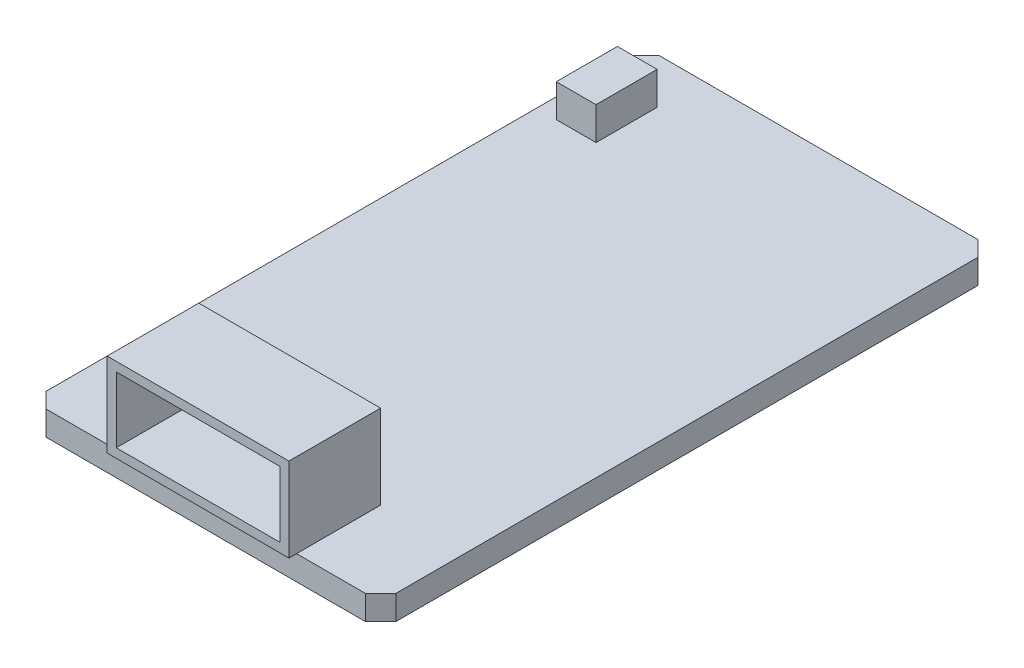
ISO-10303-21;
HEADER;
FILE_DESCRIPTION(('STEP AP214'),'2;1');
FILE_NAME('part.step','',(''),(''),'','','');
FILE_SCHEMA(('AUTOMOTIVE_DESIGN { 1 0 10303 214 1 1 1 1 }'));
ENDSEC;
DATA;
#1=APPLICATION_CONTEXT('core data for automotive mechanical design processes');
#2=APPLICATION_PROTOCOL_DEFINITION('international standard','automotive_design',2000,#1);
#3=PRODUCT_CONTEXT('',#1,'mechanical');
#4=PRODUCT('Part','Part','',(#3));
#5=PRODUCT_RELATED_PRODUCT_CATEGORY('part','',(#4));
#6=PRODUCT_DEFINITION_FORMATION('','',#4);
#7=PRODUCT_DEFINITION_CONTEXT('part definition',#1,'design');
#8=PRODUCT_DEFINITION('design','',#6,#7);
#9=PRODUCT_DEFINITION_SHAPE('','',#8);
#10=(LENGTH_UNIT() NAMED_UNIT(*) SI_UNIT(.MILLI.,.METRE.));
#11=(NAMED_UNIT(*) PLANE_ANGLE_UNIT() SI_UNIT($,.RADIAN.));
#12=(NAMED_UNIT(*) SI_UNIT($,.STERADIAN.) SOLID_ANGLE_UNIT());
#13=UNCERTAINTY_MEASURE_WITH_UNIT(LENGTH_MEASURE(1.E-05),#10,'distance_accuracy_value','');
#14=(GEOMETRIC_REPRESENTATION_CONTEXT(3) GLOBAL_UNCERTAINTY_ASSIGNED_CONTEXT((#13)) GLOBAL_UNIT_ASSIGNED_CONTEXT((#10,
#11,#12)) REPRESENTATION_CONTEXT('',''));
#15=CARTESIAN_POINT('',(0.,0.,0.));
#16=DIRECTION('',(0.,0.,1.));
#17=DIRECTION('',(1.,0.,0.));
#18=AXIS2_PLACEMENT_3D('',#15,#16,#17);
#19=CARTESIAN_POINT('',(0.,0.,20.55));
#20=DIRECTION('',(0.,0.,-1.));
#21=DIRECTION('',(-1.,0.,0.));
#22=AXIS2_PLACEMENT_3D('',#19,#20,#21);
#23=PLANE('',#22);
#24=DIRECTION('',(0.,-1.,0.));
#25=VECTOR('',#24,1.);
#26=CARTESIAN_POINT('',(-5.95,1.6,20.55));
#27=LINE('',#26,#25);
#28=CARTESIAN_POINT('',(-5.95,7.1,20.55));
#29=VERTEX_POINT('',#28);
#30=CARTESIAN_POINT('',(-5.95,1.6,20.55));
#31=VERTEX_POINT('',#30);
#32=EDGE_CURVE('E171',#29,#31,#27,.T.);
#33=ORIENTED_EDGE('',*,*,#32,.T.);
#34=DIRECTION('',(1.,0.,0.));
#35=VECTOR('',#34,1.);
#36=CARTESIAN_POINT('',(-5.95,1.6,20.55));
#37=LINE('',#36,#35);
#38=CARTESIAN_POINT('',(5.95,1.6,20.55));
#39=VERTEX_POINT('',#38);
#40=EDGE_CURVE('E174',#31,#39,#37,.T.);
#41=ORIENTED_EDGE('',*,*,#40,.T.);
#42=DIRECTION('',(0.,1.,0.));
#43=VECTOR('',#42,1.);
#44=CARTESIAN_POINT('',(5.95,1.6,20.55));
#45=LINE('',#44,#43);
#46=CARTESIAN_POINT('',(5.95,7.1,20.55));
#47=VERTEX_POINT('',#46);
#48=EDGE_CURVE('E177',#39,#47,#45,.T.);
#49=ORIENTED_EDGE('',*,*,#48,.T.);
#50=DIRECTION('',(-1.,0.,0.));
#51=VECTOR('',#50,1.);
#52=CARTESIAN_POINT('',(-5.95,7.1,20.55));
#53=LINE('',#52,#51);
#54=EDGE_CURVE('E180',#47,#29,#53,.T.);
#55=ORIENTED_EDGE('',*,*,#54,.T.);
#56=EDGE_LOOP('',(#33,#41,#49,#55));
#57=FACE_BOUND('',#56,.T.);
#58=DIRECTION('',(0.,-1.,0.));
#59=VECTOR('',#58,1.);
#60=CARTESIAN_POINT('',(-5.35,1.6,20.55));
#61=LINE('',#60,#59);
#62=CARTESIAN_POINT('',(-5.35,6.5,20.55));
#63=VERTEX_POINT('',#62);
#64=CARTESIAN_POINT('',(-5.35,2.2,20.55));
#65=VERTEX_POINT('',#64);
#66=EDGE_CURVE('E138',#63,#65,#61,.T.);
#67=ORIENTED_EDGE('',*,*,#66,.F.);
#68=DIRECTION('',(-1.,0.,0.));
#69=VECTOR('',#68,1.);
#70=CARTESIAN_POINT('',(-5.95,6.5,20.55));
#71=LINE('',#70,#69);
#72=CARTESIAN_POINT('',(5.35,6.5,20.55));
#73=VERTEX_POINT('',#72);
#74=EDGE_CURVE('E155',#73,#63,#71,.T.);
#75=ORIENTED_EDGE('',*,*,#74,.F.);
#76=DIRECTION('',(0.,1.,0.));
#77=VECTOR('',#76,1.);
#78=CARTESIAN_POINT('',(5.35,1.6,20.55));
#79=LINE('',#78,#77);
#80=CARTESIAN_POINT('',(5.35,2.2,20.55));
#81=VERTEX_POINT('',#80);
#82=EDGE_CURVE('E82',#81,#73,#79,.T.);
#83=ORIENTED_EDGE('',*,*,#82,.F.);
#84=DIRECTION('',(1.,0.,0.));
#85=VECTOR('',#84,1.);
#86=CARTESIAN_POINT('',(-5.95,2.2,20.55));
#87=LINE('',#86,#85);
#88=EDGE_CURVE('E168',#65,#81,#87,.T.);
#89=ORIENTED_EDGE('',*,*,#88,.F.);
#90=EDGE_LOOP('',(#67,#75,#83,#89));
#91=FACE_BOUND('',#90,.T.);
#92=ADVANCED_FACE('F65',(#57,#91),#23,.F.);
#93=CARTESIAN_POINT('',(-5.95,1.6,14.55));
#94=DIRECTION('',(-1.,0.,0.));
#95=DIRECTION('',(0.,0.,1.));
#96=AXIS2_PLACEMENT_3D('',#93,#94,#95);
#97=PLANE('',#96);
#98=DIRECTION('',(0.,0.,1.));
#99=VECTOR('',#98,1.);
#100=CARTESIAN_POINT('',(-5.95,1.6,14.55));
#101=LINE('',#100,#99);
#102=CARTESIAN_POINT('',(-5.95,1.6,14.55));
#103=VERTEX_POINT('',#102);
#104=EDGE_CURVE('E69',#103,#31,#101,.T.);
#105=ORIENTED_EDGE('',*,*,#104,.T.);
#106=ORIENTED_EDGE('',*,*,#32,.F.);
#107=DIRECTION('',(0.,0.,1.));
#108=VECTOR('',#107,1.);
#109=CARTESIAN_POINT('',(-5.95,7.1,14.55));
#110=LINE('',#109,#108);
#111=CARTESIAN_POINT('',(-5.95,7.1,14.55));
#112=VERTEX_POINT('',#111);
#113=EDGE_CURVE('E12',#112,#29,#110,.T.);
#114=ORIENTED_EDGE('',*,*,#113,.F.);
#115=DIRECTION('',(0.,-1.,0.));
#116=VECTOR('',#115,1.);
#117=CARTESIAN_POINT('',(-5.95,1.6,14.55));
#118=LINE('',#117,#116);
#119=EDGE_CURVE('E183',#112,#103,#118,.T.);
#120=ORIENTED_EDGE('',*,*,#119,.T.);
#121=EDGE_LOOP('',(#105,#106,#114,#120));
#122=FACE_BOUND('',#121,.T.);
#123=ADVANCED_FACE('F67',(#122),#97,.T.);
#124=CARTESIAN_POINT('',(-5.95,7.1,14.55));
#125=DIRECTION('',(0.,1.,0.));
#126=DIRECTION('',(0.,0.,1.));
#127=AXIS2_PLACEMENT_3D('',#124,#125,#126);
#128=PLANE('',#127);
#129=ORIENTED_EDGE('',*,*,#113,.T.);
#130=ORIENTED_EDGE('',*,*,#54,.F.);
#131=DIRECTION('',(0.,0.,1.));
#132=VECTOR('',#131,1.);
#133=CARTESIAN_POINT('',(5.95,7.1,14.55));
#134=LINE('',#133,#132);
#135=CARTESIAN_POINT('',(5.95,7.1,14.55));
#136=VERTEX_POINT('',#135);
#137=EDGE_CURVE('E74',#136,#47,#134,.T.);
#138=ORIENTED_EDGE('',*,*,#137,.F.);
#139=DIRECTION('',(-1.,0.,0.));
#140=VECTOR('',#139,1.);
#141=CARTESIAN_POINT('',(-5.95,7.1,14.55));
#142=LINE('',#141,#140);
#143=EDGE_CURVE('E191',#136,#112,#142,.T.);
#144=ORIENTED_EDGE('',*,*,#143,.T.);
#145=EDGE_LOOP('',(#129,#130,#138,#144));
#146=FACE_BOUND('',#145,.T.);
#147=ADVANCED_FACE('F204',(#146),#128,.T.);
#148=CARTESIAN_POINT('',(5.95,1.6,14.55));
#149=DIRECTION('',(1.,0.,0.));
#150=DIRECTION('',(0.,0.,-1.));
#151=AXIS2_PLACEMENT_3D('',#148,#149,#150);
#152=PLANE('',#151);
#153=ORIENTED_EDGE('',*,*,#137,.T.);
#154=ORIENTED_EDGE('',*,*,#48,.F.);
#155=DIRECTION('',(0.,0.,1.));
#156=VECTOR('',#155,1.);
#157=CARTESIAN_POINT('',(5.95,1.6,14.55));
#158=LINE('',#157,#156);
#159=CARTESIAN_POINT('',(5.95,1.6,14.55));
#160=VERTEX_POINT('',#159);
#161=EDGE_CURVE('E194',#160,#39,#158,.T.);
#162=ORIENTED_EDGE('',*,*,#161,.F.);
#163=DIRECTION('',(0.,1.,0.));
#164=VECTOR('',#163,1.);
#165=CARTESIAN_POINT('',(5.95,1.6,14.55));
#166=LINE('',#165,#164);
#167=EDGE_CURVE('E188',#160,#136,#166,.T.);
#168=ORIENTED_EDGE('',*,*,#167,.T.);
#169=EDGE_LOOP('',(#153,#154,#162,#168));
#170=FACE_BOUND('',#169,.T.);
#171=ADVANCED_FACE('F210',(#170),#152,.T.);
#172=CARTESIAN_POINT('',(-5.95,1.6,14.55));
#173=DIRECTION('',(0.,-1.,0.));
#174=DIRECTION('',(0.,0.,-1.));
#175=AXIS2_PLACEMENT_3D('',#172,#173,#174);
#176=PLANE('',#175);
#177=ORIENTED_EDGE('',*,*,#161,.T.);
#178=ORIENTED_EDGE('',*,*,#40,.F.);
#179=ORIENTED_EDGE('',*,*,#104,.F.);
#180=DIRECTION('',(1.,0.,0.));
#181=VECTOR('',#180,1.);
#182=CARTESIAN_POINT('',(-5.95,1.6,14.55));
#183=LINE('',#182,#181);
#184=EDGE_CURVE('E185',#103,#160,#183,.T.);
#185=ORIENTED_EDGE('',*,*,#184,.T.);
#186=EDGE_LOOP('',(#177,#178,#179,#185));
#187=FACE_BOUND('',#186,.T.);
#188=ADVANCED_FACE('F198',(#187),#176,.T.);
#189=CARTESIAN_POINT('',(0.,0.,14.55));
#190=DIRECTION('',(0.,0.,-1.));
#191=DIRECTION('',(-1.,0.,0.));
#192=AXIS2_PLACEMENT_3D('',#189,#190,#191);
#193=PLANE('',#192);
#194=ORIENTED_EDGE('',*,*,#119,.F.);
#195=ORIENTED_EDGE('',*,*,#143,.F.);
#196=ORIENTED_EDGE('',*,*,#167,.F.);
#197=ORIENTED_EDGE('',*,*,#184,.F.);
#198=EDGE_LOOP('',(#194,#195,#196,#197));
#199=FACE_BOUND('',#198,.T.);
#200=ADVANCED_FACE('F208',(#199),#193,.T.);
#201=CARTESIAN_POINT('',(-5.35,1.6,14.55));
#202=DIRECTION('',(-1.,0.,0.));
#203=DIRECTION('',(0.,0.,1.));
#204=AXIS2_PLACEMENT_3D('',#201,#202,#203);
#205=PLANE('',#204);
#206=DIRECTION('',(0.,0.,1.));
#207=VECTOR('',#206,1.);
#208=CARTESIAN_POINT('',(-5.35,2.2,14.55));
#209=LINE('',#208,#207);
#210=CARTESIAN_POINT('',(-5.35,2.2,15.15));
#211=VERTEX_POINT('',#210);
#212=EDGE_CURVE('E131',#211,#65,#209,.T.);
#213=ORIENTED_EDGE('',*,*,#212,.F.);
#214=DIRECTION('',(0.,-1.,0.));
#215=VECTOR('',#214,1.);
#216=CARTESIAN_POINT('',(-5.35,1.6,15.15));
#217=LINE('',#216,#215);
#218=CARTESIAN_POINT('',(-5.35,6.5,15.15));
#219=VERTEX_POINT('',#218);
#220=EDGE_CURVE('E135',#219,#211,#217,.T.);
#221=ORIENTED_EDGE('',*,*,#220,.F.);
#222=DIRECTION('',(0.,0.,1.));
#223=VECTOR('',#222,1.);
#224=CARTESIAN_POINT('',(-5.35,6.5,14.55));
#225=LINE('',#224,#223);
#226=EDGE_CURVE('E161',#219,#63,#225,.T.);
#227=ORIENTED_EDGE('',*,*,#226,.T.);
#228=ORIENTED_EDGE('',*,*,#66,.T.);
#229=EDGE_LOOP('',(#213,#221,#227,#228));
#230=FACE_BOUND('',#229,.T.);
#231=ADVANCED_FACE('F133',(#230),#205,.F.);
#232=CARTESIAN_POINT('',(-5.95,6.5,14.55));
#233=DIRECTION('',(0.,1.,0.));
#234=DIRECTION('',(0.,0.,1.));
#235=AXIS2_PLACEMENT_3D('',#232,#233,#234);
#236=PLANE('',#235);
#237=ORIENTED_EDGE('',*,*,#226,.F.);
#238=DIRECTION('',(-1.,0.,0.));
#239=VECTOR('',#238,1.);
#240=CARTESIAN_POINT('',(-5.95,6.5,15.15));
#241=LINE('',#240,#239);
#242=CARTESIAN_POINT('',(5.35,6.5,15.15));
#243=VERTEX_POINT('',#242);
#244=EDGE_CURVE('E143',#243,#219,#241,.T.);
#245=ORIENTED_EDGE('',*,*,#244,.F.);
#246=DIRECTION('',(0.,0.,1.));
#247=VECTOR('',#246,1.);
#248=CARTESIAN_POINT('',(5.35,6.5,14.55));
#249=LINE('',#248,#247);
#250=EDGE_CURVE('E162',#243,#73,#249,.T.);
#251=ORIENTED_EDGE('',*,*,#250,.T.);
#252=ORIENTED_EDGE('',*,*,#74,.T.);
#253=EDGE_LOOP('',(#237,#245,#251,#252));
#254=FACE_BOUND('',#253,.T.);
#255=ADVANCED_FACE('F230',(#254),#236,.F.);
#256=CARTESIAN_POINT('',(5.35,1.6,14.55));
#257=DIRECTION('',(1.,0.,0.));
#258=DIRECTION('',(0.,0.,-1.));
#259=AXIS2_PLACEMENT_3D('',#256,#257,#258);
#260=PLANE('',#259);
#261=ORIENTED_EDGE('',*,*,#250,.F.);
#262=DIRECTION('',(0.,1.,0.));
#263=VECTOR('',#262,1.);
#264=CARTESIAN_POINT('',(5.35,1.6,15.15));
#265=LINE('',#264,#263);
#266=CARTESIAN_POINT('',(5.35,2.2,15.15));
#267=VERTEX_POINT('',#266);
#268=EDGE_CURVE('E151',#267,#243,#265,.T.);
#269=ORIENTED_EDGE('',*,*,#268,.F.);
#270=DIRECTION('',(0.,0.,1.));
#271=VECTOR('',#270,1.);
#272=CARTESIAN_POINT('',(5.35,2.2,14.55));
#273=LINE('',#272,#271);
#274=EDGE_CURVE('E142',#267,#81,#273,.T.);
#275=ORIENTED_EDGE('',*,*,#274,.T.);
#276=ORIENTED_EDGE('',*,*,#82,.T.);
#277=EDGE_LOOP('',(#261,#269,#275,#276));
#278=FACE_BOUND('',#277,.T.);
#279=ADVANCED_FACE('F235',(#278),#260,.F.);
#280=CARTESIAN_POINT('',(-5.95,2.2,14.55));
#281=DIRECTION('',(0.,-1.,0.));
#282=DIRECTION('',(0.,0.,-1.));
#283=AXIS2_PLACEMENT_3D('',#280,#281,#282);
#284=PLANE('',#283);
#285=ORIENTED_EDGE('',*,*,#274,.F.);
#286=DIRECTION('',(1.,0.,0.));
#287=VECTOR('',#286,1.);
#288=CARTESIAN_POINT('',(-5.95,2.2,15.15));
#289=LINE('',#288,#287);
#290=EDGE_CURVE('E146',#211,#267,#289,.T.);
#291=ORIENTED_EDGE('',*,*,#290,.F.);
#292=ORIENTED_EDGE('',*,*,#212,.T.);
#293=ORIENTED_EDGE('',*,*,#88,.T.);
#294=EDGE_LOOP('',(#285,#291,#292,#293));
#295=FACE_BOUND('',#294,.T.);
#296=ADVANCED_FACE('F147',(#295),#284,.F.);
#297=CARTESIAN_POINT('',(0.,0.,15.15));
#298=DIRECTION('',(0.,0.,-1.));
#299=DIRECTION('',(-1.,0.,0.));
#300=AXIS2_PLACEMENT_3D('',#297,#298,#299);
#301=PLANE('',#300);
#302=ORIENTED_EDGE('',*,*,#220,.T.);
#303=ORIENTED_EDGE('',*,*,#290,.T.);
#304=ORIENTED_EDGE('',*,*,#268,.T.);
#305=ORIENTED_EDGE('',*,*,#244,.T.);
#306=EDGE_LOOP('',(#302,#303,#304,#305));
#307=FACE_BOUND('',#306,.T.);
#308=ADVANCED_FACE('F153',(#307),#301,.F.);
#309=CLOSED_SHELL('',(#92,#123,#147,#171,#188,#200,#231,#255,#279,#296,#308));
#310=MANIFOLD_SOLID_BREP('B2',#309);
#311=CARTESIAN_POINT('',(0.,1.6,0.));
#312=DIRECTION('',(0.,1.,0.));
#313=DIRECTION('',(0.,0.,1.));
#314=AXIS2_PLACEMENT_3D('',#311,#312,#313);
#315=PLANE('',#314);
#316=DIRECTION('',(0.,0.,-1.));
#317=VECTOR('',#316,1.);
#318=CARTESIAN_POINT('',(11.45,1.6,20.05));
#319=LINE('',#318,#317);
#320=CARTESIAN_POINT('',(11.45,1.6,19.05));
#321=VERTEX_POINT('',#320);
#322=CARTESIAN_POINT('',(11.45,1.6,-19.05));
#323=VERTEX_POINT('',#322);
#324=EDGE_CURVE('E477',#321,#323,#319,.T.);
#325=ORIENTED_EDGE('',*,*,#324,.T.);
#326=DIRECTION('',(0.707106781186548,0.,0.707106781186548));
#327=VECTOR('',#326,1.);
#328=CARTESIAN_POINT('',(15.25,1.6,-15.25));
#329=LINE('',#328,#327);
#330=CARTESIAN_POINT('',(10.45,1.6,-20.05));
#331=VERTEX_POINT('',#330);
#332=EDGE_CURVE('E513',#323,#331,#329,.F.);
#333=ORIENTED_EDGE('',*,*,#332,.T.);
#334=DIRECTION('',(-1.,0.,0.));
#335=VECTOR('',#334,1.);
#336=CARTESIAN_POINT('',(11.45,1.6,-20.05));
#337=LINE('',#336,#335);
#338=CARTESIAN_POINT('',(-10.45,1.6,-20.05));
#339=VERTEX_POINT('',#338);
#340=EDGE_CURVE('E480',#331,#339,#337,.T.);
#341=ORIENTED_EDGE('',*,*,#340,.T.);
#342=DIRECTION('',(0.707106781186548,0.,-0.707106781186548));
#343=VECTOR('',#342,1.);
#344=CARTESIAN_POINT('',(-15.25,1.6,-15.25));
#345=LINE('',#344,#343);
#346=CARTESIAN_POINT('',(-11.45,1.6,-19.05));
#347=VERTEX_POINT('',#346);
#348=EDGE_CURVE('E511',#339,#347,#345,.F.);
#349=ORIENTED_EDGE('',*,*,#348,.T.);
#350=DIRECTION('',(0.,0.,1.));
#351=VECTOR('',#350,1.);
#352=CARTESIAN_POINT('',(-11.45,1.6,20.05));
#353=LINE('',#352,#351);
#354=CARTESIAN_POINT('',(-11.45,1.6,19.05));
#355=VERTEX_POINT('',#354);
#356=EDGE_CURVE('E471',#347,#355,#353,.T.);
#357=ORIENTED_EDGE('',*,*,#356,.T.);
#358=DIRECTION('',(-0.707106781186548,0.,-0.707106781186548));
#359=VECTOR('',#358,1.);
#360=CARTESIAN_POINT('',(-15.25,1.6,15.25));
#361=LINE('',#360,#359);
#362=CARTESIAN_POINT('',(-10.45,1.6,20.05));
#363=VERTEX_POINT('',#362);
#364=EDGE_CURVE('E507',#355,#363,#361,.F.);
#365=ORIENTED_EDGE('',*,*,#364,.T.);
#366=DIRECTION('',(1.,0.,0.));
#367=VECTOR('',#366,1.);
#368=CARTESIAN_POINT('',(11.45,1.6,20.05));
#369=LINE('',#368,#367);
#370=CARTESIAN_POINT('',(10.45,1.6,20.05));
#371=VERTEX_POINT('',#370);
#372=EDGE_CURVE('E474',#363,#371,#369,.T.);
#373=ORIENTED_EDGE('',*,*,#372,.T.);
#374=DIRECTION('',(-0.707106781186548,0.,0.707106781186548));
#375=VECTOR('',#374,1.);
#376=CARTESIAN_POINT('',(15.25,1.6,15.25));
#377=LINE('',#376,#375);
#378=EDGE_CURVE('E509',#371,#321,#377,.F.);
#379=ORIENTED_EDGE('',*,*,#378,.T.);
#380=EDGE_LOOP('',(#325,#333,#341,#349,#357,#365,#373,#379));
#381=FACE_BOUND('',#380,.T.);
#382=DIRECTION('',(1.,0.,0.));
#383=VECTOR('',#382,1.);
#384=CARTESIAN_POINT('',(-10.15,1.6,-13.05));
#385=LINE('',#384,#383);
#386=CARTESIAN_POINT('',(-10.15,1.6,-13.05));
#387=VERTEX_POINT('',#386);
#388=CARTESIAN_POINT('',(-7.55,1.6,-13.05));
#389=VERTEX_POINT('',#388);
#390=EDGE_CURVE('E662',#387,#389,#385,.T.);
#391=ORIENTED_EDGE('',*,*,#390,.F.);
#392=DIRECTION('',(0.,0.,1.));
#393=VECTOR('',#392,1.);
#394=CARTESIAN_POINT('',(-10.15,1.6,-17.05));
#395=LINE('',#394,#393);
#396=CARTESIAN_POINT('',(-10.15,1.6,-17.05));
#397=VERTEX_POINT('',#396);
#398=EDGE_CURVE('E461',#397,#387,#395,.T.);
#399=ORIENTED_EDGE('',*,*,#398,.F.);
#400=DIRECTION('',(-1.,0.,0.));
#401=VECTOR('',#400,1.);
#402=CARTESIAN_POINT('',(-10.15,1.6,-17.05));
#403=LINE('',#402,#401);
#404=CARTESIAN_POINT('',(-7.55,1.6,-17.05));
#405=VERTEX_POINT('',#404);
#406=EDGE_CURVE('E457',#405,#397,#403,.T.);
#407=ORIENTED_EDGE('',*,*,#406,.F.);
#408=DIRECTION('',(0.,0.,-1.));
#409=VECTOR('',#408,1.);
#410=CARTESIAN_POINT('',(-7.55,1.6,-17.05));
#411=LINE('',#410,#409);
#412=EDGE_CURVE('E659',#389,#405,#411,.T.);
#413=ORIENTED_EDGE('',*,*,#412,.F.);
#414=EDGE_LOOP('',(#391,#399,#407,#413));
#415=FACE_BOUND('',#414,.T.);
#416=ADVANCED_FACE('F348',(#381,#415),#315,.T.);
#417=CARTESIAN_POINT('',(-11.45,1.6,20.05));
#418=DIRECTION('',(1.,0.,0.));
#419=DIRECTION('',(0.,0.,-1.));
#420=AXIS2_PLACEMENT_3D('',#417,#418,#419);
#421=PLANE('',#420);
#422=ORIENTED_EDGE('',*,*,#356,.F.);
#423=DIRECTION('',(0.,-1.,0.));
#424=VECTOR('',#423,1.);
#425=CARTESIAN_POINT('',(-11.45,1.6,-19.05));
#426=LINE('',#425,#424);
#427=CARTESIAN_POINT('',(-11.45,0.,-19.05));
#428=VERTEX_POINT('',#427);
#429=EDGE_CURVE('E517',#347,#428,#426,.T.);
#430=ORIENTED_EDGE('',*,*,#429,.T.);
#431=DIRECTION('',(0.,0.,1.));
#432=VECTOR('',#431,1.);
#433=CARTESIAN_POINT('',(-11.45,0.,20.05));
#434=LINE('',#433,#432);
#435=CARTESIAN_POINT('',(-11.45,0.,19.05));
#436=VERTEX_POINT('',#435);
#437=EDGE_CURVE('E463',#428,#436,#434,.T.);
#438=ORIENTED_EDGE('',*,*,#437,.T.);
#439=DIRECTION('',(0.,1.,0.));
#440=VECTOR('',#439,1.);
#441=CARTESIAN_POINT('',(-11.45,1.6,19.05));
#442=LINE('',#441,#440);
#443=EDGE_CURVE('E515',#436,#355,#442,.T.);
#444=ORIENTED_EDGE('',*,*,#443,.T.);
#445=EDGE_LOOP('',(#422,#430,#438,#444));
#446=FACE_BOUND('',#445,.T.);
#447=ADVANCED_FACE('F554',(#446),#421,.F.);
#448=CARTESIAN_POINT('',(11.45,1.6,20.05));
#449=DIRECTION('',(0.,0.,-1.));
#450=DIRECTION('',(-1.,0.,0.));
#451=AXIS2_PLACEMENT_3D('',#448,#449,#450);
#452=PLANE('',#451);
#453=DIRECTION('',(1.,0.,0.));
#454=VECTOR('',#453,1.);
#455=CARTESIAN_POINT('',(11.45,0.,20.05));
#456=LINE('',#455,#454);
#457=CARTESIAN_POINT('',(-10.45,0.,20.05));
#458=VERTEX_POINT('',#457);
#459=CARTESIAN_POINT('',(10.45,0.,20.05));
#460=VERTEX_POINT('',#459);
#461=EDGE_CURVE('E466',#458,#460,#456,.T.);
#462=ORIENTED_EDGE('',*,*,#461,.T.);
#463=DIRECTION('',(0.,1.,0.));
#464=VECTOR('',#463,1.);
#465=CARTESIAN_POINT('',(10.45,1.6,20.05));
#466=LINE('',#465,#464);
#467=EDGE_CURVE('E63',#460,#371,#466,.T.);
#468=ORIENTED_EDGE('',*,*,#467,.T.);
#469=ORIENTED_EDGE('',*,*,#372,.F.);
#470=DIRECTION('',(0.,-1.,0.));
#471=VECTOR('',#470,1.);
#472=CARTESIAN_POINT('',(-10.45,1.6,20.05));
#473=LINE('',#472,#471);
#474=EDGE_CURVE('E357',#363,#458,#473,.T.);
#475=ORIENTED_EDGE('',*,*,#474,.T.);
#476=EDGE_LOOP('',(#462,#468,#469,#475));
#477=FACE_BOUND('',#476,.T.);
#478=ADVANCED_FACE('F522',(#477),#452,.F.);
#479=CARTESIAN_POINT('',(11.45,1.6,20.05));
#480=DIRECTION('',(-1.,0.,0.));
#481=DIRECTION('',(0.,0.,1.));
#482=AXIS2_PLACEMENT_3D('',#479,#480,#481);
#483=PLANE('',#482);
#484=DIRECTION('',(0.,0.,-1.));
#485=VECTOR('',#484,1.);
#486=CARTESIAN_POINT('',(11.45,0.,20.05));
#487=LINE('',#486,#485);
#488=CARTESIAN_POINT('',(11.45,0.,19.05));
#489=VERTEX_POINT('',#488);
#490=CARTESIAN_POINT('',(11.45,0.,-19.05));
#491=VERTEX_POINT('',#490);
#492=EDGE_CURVE('E485',#489,#491,#487,.T.);
#493=ORIENTED_EDGE('',*,*,#492,.T.);
#494=DIRECTION('',(0.,1.,0.));
#495=VECTOR('',#494,1.);
#496=CARTESIAN_POINT('',(11.45,1.6,-19.05));
#497=LINE('',#496,#495);
#498=EDGE_CURVE('E505',#491,#323,#497,.T.);
#499=ORIENTED_EDGE('',*,*,#498,.T.);
#500=ORIENTED_EDGE('',*,*,#324,.F.);
#501=DIRECTION('',(0.,-1.,0.));
#502=VECTOR('',#501,1.);
#503=CARTESIAN_POINT('',(11.45,1.6,19.05));
#504=LINE('',#503,#502);
#505=EDGE_CURVE('E502',#321,#489,#504,.T.);
#506=ORIENTED_EDGE('',*,*,#505,.T.);
#507=EDGE_LOOP('',(#493,#499,#500,#506));
#508=FACE_BOUND('',#507,.T.);
#509=ADVANCED_FACE('F536',(#508),#483,.F.);
#510=CARTESIAN_POINT('',(11.45,1.6,-20.05));
#511=DIRECTION('',(0.,0.,1.));
#512=DIRECTION('',(1.,0.,0.));
#513=AXIS2_PLACEMENT_3D('',#510,#511,#512);
#514=PLANE('',#513);
#515=ORIENTED_EDGE('',*,*,#340,.F.);
#516=DIRECTION('',(0.,-1.,0.));
#517=VECTOR('',#516,1.);
#518=CARTESIAN_POINT('',(10.45,1.6,-20.05));
#519=LINE('',#518,#517);
#520=CARTESIAN_POINT('',(10.45,0.,-20.05));
#521=VERTEX_POINT('',#520);
#522=EDGE_CURVE('E491',#331,#521,#519,.T.);
#523=ORIENTED_EDGE('',*,*,#522,.T.);
#524=DIRECTION('',(-1.,0.,0.));
#525=VECTOR('',#524,1.);
#526=CARTESIAN_POINT('',(11.45,0.,-20.05));
#527=LINE('',#526,#525);
#528=CARTESIAN_POINT('',(-10.45,0.,-20.05));
#529=VERTEX_POINT('',#528);
#530=EDGE_CURVE('E475',#521,#529,#527,.T.);
#531=ORIENTED_EDGE('',*,*,#530,.T.);
#532=DIRECTION('',(0.,1.,0.));
#533=VECTOR('',#532,1.);
#534=CARTESIAN_POINT('',(-10.45,1.6,-20.05));
#535=LINE('',#534,#533);
#536=EDGE_CURVE('E482',#529,#339,#535,.T.);
#537=ORIENTED_EDGE('',*,*,#536,.T.);
#538=EDGE_LOOP('',(#515,#523,#531,#537));
#539=FACE_BOUND('',#538,.T.);
#540=ADVANCED_FACE('F546',(#539),#514,.F.);
#541=CARTESIAN_POINT('',(0.,0.,0.));
#542=DIRECTION('',(0.,1.,0.));
#543=DIRECTION('',(0.,0.,1.));
#544=AXIS2_PLACEMENT_3D('',#541,#542,#543);
#545=PLANE('',#544);
#546=ORIENTED_EDGE('',*,*,#530,.F.);
#547=DIRECTION('',(-0.707106781186548,0.,-0.707106781186548));
#548=VECTOR('',#547,1.);
#549=CARTESIAN_POINT('',(10.45,0.,-20.05));
#550=LINE('',#549,#548);
#551=EDGE_CURVE('E500',#521,#491,#550,.F.);
#552=ORIENTED_EDGE('',*,*,#551,.T.);
#553=ORIENTED_EDGE('',*,*,#492,.F.);
#554=DIRECTION('',(0.707106781186548,0.,-0.707106781186548));
#555=VECTOR('',#554,1.);
#556=CARTESIAN_POINT('',(11.45,0.,19.05));
#557=LINE('',#556,#555);
#558=EDGE_CURVE('E496',#489,#460,#557,.F.);
#559=ORIENTED_EDGE('',*,*,#558,.T.);
#560=ORIENTED_EDGE('',*,*,#461,.F.);
#561=DIRECTION('',(0.707106781186548,0.,0.707106781186548));
#562=VECTOR('',#561,1.);
#563=CARTESIAN_POINT('',(-10.45,0.,20.05));
#564=LINE('',#563,#562);
#565=EDGE_CURVE('E494',#458,#436,#564,.F.);
#566=ORIENTED_EDGE('',*,*,#565,.T.);
#567=ORIENTED_EDGE('',*,*,#437,.F.);
#568=DIRECTION('',(-0.707106781186548,0.,0.707106781186548));
#569=VECTOR('',#568,1.);
#570=CARTESIAN_POINT('',(-11.45,0.,-19.05));
#571=LINE('',#570,#569);
#572=EDGE_CURVE('E498',#428,#529,#571,.F.);
#573=ORIENTED_EDGE('',*,*,#572,.T.);
#574=EDGE_LOOP('',(#546,#552,#553,#559,#560,#566,#567,#573));
#575=FACE_BOUND('',#574,.T.);
#576=ADVANCED_FACE('F527',(#575),#545,.F.);
#577=CARTESIAN_POINT('',(10.45,1.6,-20.05));
#578=DIRECTION('',(-0.707106781186547,0.,0.707106781186547));
#579=DIRECTION('',(0.,-1.,0.));
#580=AXIS2_PLACEMENT_3D('',#577,#578,#579);
#581=PLANE('',#580);
#582=ORIENTED_EDGE('',*,*,#332,.F.);
#583=ORIENTED_EDGE('',*,*,#498,.F.);
#584=ORIENTED_EDGE('',*,*,#551,.F.);
#585=ORIENTED_EDGE('',*,*,#522,.F.);
#586=EDGE_LOOP('',(#582,#583,#584,#585));
#587=FACE_BOUND('',#586,.T.);
#588=ADVANCED_FACE('F544',(#587),#581,.F.);
#589=CARTESIAN_POINT('',(-11.45,1.6,-19.05));
#590=DIRECTION('',(0.707106781186547,0.,0.707106781186547));
#591=DIRECTION('',(0.,-1.,0.));
#592=AXIS2_PLACEMENT_3D('',#589,#590,#591);
#593=PLANE('',#592);
#594=ORIENTED_EDGE('',*,*,#348,.F.);
#595=ORIENTED_EDGE('',*,*,#536,.F.);
#596=ORIENTED_EDGE('',*,*,#572,.F.);
#597=ORIENTED_EDGE('',*,*,#429,.F.);
#598=EDGE_LOOP('',(#594,#595,#596,#597));
#599=FACE_BOUND('',#598,.T.);
#600=ADVANCED_FACE('F551',(#599),#593,.F.);
#601=CARTESIAN_POINT('',(11.45,1.6,19.05));
#602=DIRECTION('',(-0.707106781186547,0.,-0.707106781186547));
#603=DIRECTION('',(0.,-1.,0.));
#604=AXIS2_PLACEMENT_3D('',#601,#602,#603);
#605=PLANE('',#604);
#606=ORIENTED_EDGE('',*,*,#378,.F.);
#607=ORIENTED_EDGE('',*,*,#467,.F.);
#608=ORIENTED_EDGE('',*,*,#558,.F.);
#609=ORIENTED_EDGE('',*,*,#505,.F.);
#610=EDGE_LOOP('',(#606,#607,#608,#609));
#611=FACE_BOUND('',#610,.T.);
#612=ADVANCED_FACE('F533',(#611),#605,.F.);
#613=CARTESIAN_POINT('',(-10.45,1.6,20.05));
#614=DIRECTION('',(0.707106781186547,0.,-0.707106781186547));
#615=DIRECTION('',(0.,-1.,0.));
#616=AXIS2_PLACEMENT_3D('',#613,#614,#615);
#617=PLANE('',#616);
#618=ORIENTED_EDGE('',*,*,#364,.F.);
#619=ORIENTED_EDGE('',*,*,#443,.F.);
#620=ORIENTED_EDGE('',*,*,#565,.F.);
#621=ORIENTED_EDGE('',*,*,#474,.F.);
#622=EDGE_LOOP('',(#618,#619,#620,#621));
#623=FACE_BOUND('',#622,.T.);
#624=ADVANCED_FACE('F351',(#623),#617,.F.);
#625=CARTESIAN_POINT('',(-10.15,3.75,-17.05));
#626=DIRECTION('',(1.,0.,0.));
#627=DIRECTION('',(0.,0.,-1.));
#628=AXIS2_PLACEMENT_3D('',#625,#626,#627);
#629=PLANE('',#628);
#630=ORIENTED_EDGE('',*,*,#398,.T.);
#631=DIRECTION('',(0.,-1.,0.));
#632=VECTOR('',#631,1.);
#633=CARTESIAN_POINT('',(-10.15,3.75,-13.05));
#634=LINE('',#633,#632);
#635=CARTESIAN_POINT('',(-10.15,3.75,-13.05));
#636=VERTEX_POINT('',#635);
#637=EDGE_CURVE('E442',#636,#387,#634,.T.);
#638=ORIENTED_EDGE('',*,*,#637,.F.);
#639=DIRECTION('',(0.,0.,1.));
#640=VECTOR('',#639,1.);
#641=CARTESIAN_POINT('',(-10.15,3.75,-17.05));
#642=LINE('',#641,#640);
#643=CARTESIAN_POINT('',(-10.15,3.75,-17.05));
#644=VERTEX_POINT('',#643);
#645=EDGE_CURVE('E449',#644,#636,#642,.T.);
#646=ORIENTED_EDGE('',*,*,#645,.F.);
#647=DIRECTION('',(0.,-1.,0.));
#648=VECTOR('',#647,1.);
#649=CARTESIAN_POINT('',(-10.15,3.75,-17.05));
#650=LINE('',#649,#648);
#651=EDGE_CURVE('E657',#644,#397,#650,.T.);
#652=ORIENTED_EDGE('',*,*,#651,.T.);
#653=EDGE_LOOP('',(#630,#638,#646,#652));
#654=FACE_BOUND('',#653,.T.);
#655=ADVANCED_FACE('F459',(#654),#629,.F.);
#656=CARTESIAN_POINT('',(-10.15,3.75,-13.05));
#657=DIRECTION('',(0.,0.,-1.));
#658=DIRECTION('',(-1.,0.,0.));
#659=AXIS2_PLACEMENT_3D('',#656,#657,#658);
#660=PLANE('',#659);
#661=ORIENTED_EDGE('',*,*,#390,.T.);
#662=DIRECTION('',(0.,-1.,0.));
#663=VECTOR('',#662,1.);
#664=CARTESIAN_POINT('',(-7.55,3.75,-13.05));
#665=LINE('',#664,#663);
#666=CARTESIAN_POINT('',(-7.55,3.75,-13.05));
#667=VERTEX_POINT('',#666);
#668=EDGE_CURVE('E445',#667,#389,#665,.T.);
#669=ORIENTED_EDGE('',*,*,#668,.F.);
#670=DIRECTION('',(1.,0.,0.));
#671=VECTOR('',#670,1.);
#672=CARTESIAN_POINT('',(-10.15,3.75,-13.05));
#673=LINE('',#672,#671);
#674=EDGE_CURVE('E438',#636,#667,#673,.T.);
#675=ORIENTED_EDGE('',*,*,#674,.F.);
#676=ORIENTED_EDGE('',*,*,#637,.T.);
#677=EDGE_LOOP('',(#661,#669,#675,#676));
#678=FACE_BOUND('',#677,.T.);
#679=ADVANCED_FACE('F440',(#678),#660,.F.);
#680=CARTESIAN_POINT('',(-7.55,3.75,-17.05));
#681=DIRECTION('',(-1.,0.,0.));
#682=DIRECTION('',(0.,0.,1.));
#683=AXIS2_PLACEMENT_3D('',#680,#681,#682);
#684=PLANE('',#683);
#685=ORIENTED_EDGE('',*,*,#412,.T.);
#686=DIRECTION('',(0.,-1.,0.));
#687=VECTOR('',#686,1.);
#688=CARTESIAN_POINT('',(-7.55,3.75,-17.05));
#689=LINE('',#688,#687);
#690=CARTESIAN_POINT('',(-7.55,3.75,-17.05));
#691=VERTEX_POINT('',#690);
#692=EDGE_CURVE('E364',#691,#405,#689,.T.);
#693=ORIENTED_EDGE('',*,*,#692,.F.);
#694=DIRECTION('',(0.,0.,-1.));
#695=VECTOR('',#694,1.);
#696=CARTESIAN_POINT('',(-7.55,3.75,-17.05));
#697=LINE('',#696,#695);
#698=EDGE_CURVE('E448',#667,#691,#697,.T.);
#699=ORIENTED_EDGE('',*,*,#698,.F.);
#700=ORIENTED_EDGE('',*,*,#668,.T.);
#701=EDGE_LOOP('',(#685,#693,#699,#700));
#702=FACE_BOUND('',#701,.T.);
#703=ADVANCED_FACE('F628',(#702),#684,.F.);
#704=CARTESIAN_POINT('',(-10.15,3.75,-17.05));
#705=DIRECTION('',(0.,0.,1.));
#706=DIRECTION('',(1.,0.,0.));
#707=AXIS2_PLACEMENT_3D('',#704,#705,#706);
#708=PLANE('',#707);
#709=ORIENTED_EDGE('',*,*,#406,.T.);
#710=ORIENTED_EDGE('',*,*,#651,.F.);
#711=DIRECTION('',(-1.,0.,0.));
#712=VECTOR('',#711,1.);
#713=CARTESIAN_POINT('',(-10.15,3.75,-17.05));
#714=LINE('',#713,#712);
#715=EDGE_CURVE('E453',#691,#644,#714,.T.);
#716=ORIENTED_EDGE('',*,*,#715,.F.);
#717=ORIENTED_EDGE('',*,*,#692,.T.);
#718=EDGE_LOOP('',(#709,#710,#716,#717));
#719=FACE_BOUND('',#718,.T.);
#720=ADVANCED_FACE('F636',(#719),#708,.F.);
#721=CARTESIAN_POINT('',(0.,3.75,0.));
#722=DIRECTION('',(0.,1.,0.));
#723=DIRECTION('',(0.,0.,1.));
#724=AXIS2_PLACEMENT_3D('',#721,#722,#723);
#725=PLANE('',#724);
#726=ORIENTED_EDGE('',*,*,#645,.T.);
#727=ORIENTED_EDGE('',*,*,#674,.T.);
#728=ORIENTED_EDGE('',*,*,#698,.T.);
#729=ORIENTED_EDGE('',*,*,#715,.T.);
#730=EDGE_LOOP('',(#726,#727,#728,#729));
#731=FACE_BOUND('',#730,.T.);
#732=ADVANCED_FACE('F452',(#731),#725,.T.);
#733=CLOSED_SHELL('',(#416,#447,#478,#509,#540,#576,#588,#600,#612,#624,#655,#679,#703,#720,#732));
#734=MANIFOLD_SOLID_BREP('B6',#733);
#735=ADVANCED_BREP_SHAPE_REPRESENTATION('',(#18,#310,#734),#14);
#736=SHAPE_DEFINITION_REPRESENTATION(#9,#735);
ENDSEC;
END-ISO-10303-21;
